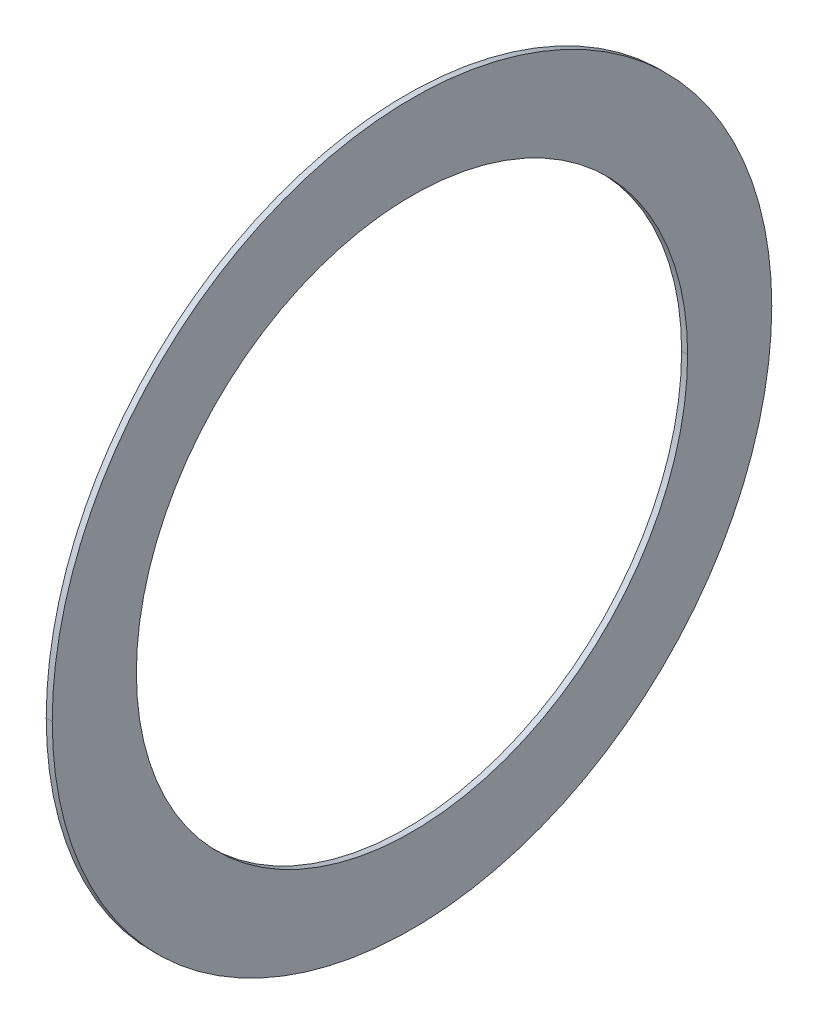
ISO-10303-21;
HEADER;
FILE_DESCRIPTION(('STEP AP214'),'2;1');
FILE_NAME('part.step','',(''),(''),'','','');
FILE_SCHEMA(('AUTOMOTIVE_DESIGN { 1 0 10303 214 1 1 1 1 }'));
ENDSEC;
DATA;
#1=APPLICATION_CONTEXT('core data for automotive mechanical design processes');
#2=APPLICATION_PROTOCOL_DEFINITION('international standard','automotive_design',2000,#1);
#3=PRODUCT_CONTEXT('',#1,'mechanical');
#4=PRODUCT('Part','Part','',(#3));
#5=PRODUCT_RELATED_PRODUCT_CATEGORY('part','',(#4));
#6=PRODUCT_DEFINITION_FORMATION('','',#4);
#7=PRODUCT_DEFINITION_CONTEXT('part definition',#1,'design');
#8=PRODUCT_DEFINITION('design','',#6,#7);
#9=PRODUCT_DEFINITION_SHAPE('','',#8);
#10=(LENGTH_UNIT() NAMED_UNIT(*) SI_UNIT(.MILLI.,.METRE.));
#11=(NAMED_UNIT(*) PLANE_ANGLE_UNIT() SI_UNIT($,.RADIAN.));
#12=(NAMED_UNIT(*) SI_UNIT($,.STERADIAN.) SOLID_ANGLE_UNIT());
#13=UNCERTAINTY_MEASURE_WITH_UNIT(LENGTH_MEASURE(1.E-05),#10,'distance_accuracy_value','');
#14=(GEOMETRIC_REPRESENTATION_CONTEXT(3) GLOBAL_UNCERTAINTY_ASSIGNED_CONTEXT((#13)) GLOBAL_UNIT_ASSIGNED_CONTEXT((#10,
#11,#12)) REPRESENTATION_CONTEXT('',''));
#15=CARTESIAN_POINT('',(0.,0.,0.));
#16=DIRECTION('',(0.,0.,1.));
#17=DIRECTION('',(1.,0.,0.));
#18=AXIS2_PLACEMENT_3D('',#15,#16,#17);
#19=CARTESIAN_POINT('',(0.,31.,0.));
#20=DIRECTION('',(-1.,0.,0.));
#21=DIRECTION('',(0.,0.,1.));
#22=AXIS2_PLACEMENT_3D('',#19,#20,#21);
#23=PLANE('',#22);
#24=CARTESIAN_POINT('',(0.,0.,0.));
#25=DIRECTION('',(1.,0.,0.));
#26=DIRECTION('',(0.,0.,-1.));
#27=AXIS2_PLACEMENT_3D('',#24,#25,#26);
#28=CIRCLE('',#27,23.75);
#29=CARTESIAN_POINT('',(0.,0.,-23.75));
#30=VERTEX_POINT('',#29);
#31=CARTESIAN_POINT('',(0.,0.,23.75));
#32=VERTEX_POINT('',#31);
#33=EDGE_CURVE('E11',#30,#32,#28,.T.);
#34=ORIENTED_EDGE('',*,*,#33,.T.);
#35=CARTESIAN_POINT('',(0.,0.,0.));
#36=DIRECTION('',(1.,0.,0.));
#37=DIRECTION('',(0.,0.,-1.));
#38=AXIS2_PLACEMENT_3D('',#35,#36,#37);
#39=CIRCLE('',#38,23.75);
#40=EDGE_CURVE('E25',#32,#30,#39,.T.);
#41=ORIENTED_EDGE('',*,*,#40,.T.);
#42=EDGE_LOOP('',(#34,#41));
#43=FACE_BOUND('',#42,.T.);
#44=CARTESIAN_POINT('',(0.,0.,0.));
#45=DIRECTION('',(1.,0.,0.));
#46=DIRECTION('',(0.,0.,-1.));
#47=AXIS2_PLACEMENT_3D('',#44,#45,#46);
#48=CIRCLE('',#47,31.);
#49=CARTESIAN_POINT('',(0.,0.,31.));
#50=VERTEX_POINT('',#49);
#51=CARTESIAN_POINT('',(0.,0.,-31.));
#52=VERTEX_POINT('',#51);
#53=EDGE_CURVE('E95',#50,#52,#48,.T.);
#54=ORIENTED_EDGE('',*,*,#53,.F.);
#55=CARTESIAN_POINT('',(0.,0.,0.));
#56=DIRECTION('',(1.,0.,0.));
#57=DIRECTION('',(0.,0.,-1.));
#58=AXIS2_PLACEMENT_3D('',#55,#56,#57);
#59=CIRCLE('',#58,31.);
#60=EDGE_CURVE('E90',#52,#50,#59,.T.);
#61=ORIENTED_EDGE('',*,*,#60,.F.);
#62=EDGE_LOOP('',(#54,#61));
#63=FACE_BOUND('',#62,.T.);
#64=ADVANCED_FACE('F17',(#43,#63),#23,.T.);
#65=CARTESIAN_POINT('',(0.5175,0.,0.));
#66=DIRECTION('',(1.,0.,0.));
#67=DIRECTION('',(0.,-1.,0.));
#68=AXIS2_PLACEMENT_3D('',#65,#66,#67);
#69=CYLINDRICAL_SURFACE('',#68,31.);
#70=DIRECTION('',(1.,0.,0.));
#71=VECTOR('',#70,1.);
#72=CARTESIAN_POINT('',(0.,0.,31.));
#73=LINE('',#72,#71);
#74=CARTESIAN_POINT('',(0.5175,0.,31.));
#75=VERTEX_POINT('',#74);
#76=EDGE_CURVE('E86',#50,#75,#73,.T.);
#77=ORIENTED_EDGE('',*,*,#76,.T.);
#78=CARTESIAN_POINT('',(0.5175,0.,0.));
#79=DIRECTION('',(1.,0.,0.));
#80=DIRECTION('',(0.,0.,-1.));
#81=AXIS2_PLACEMENT_3D('',#78,#79,#80);
#82=CIRCLE('',#81,31.);
#83=CARTESIAN_POINT('',(0.5175,0.,-31.));
#84=VERTEX_POINT('',#83);
#85=EDGE_CURVE('E81',#84,#75,#82,.T.);
#86=ORIENTED_EDGE('',*,*,#85,.F.);
#87=DIRECTION('',(1.,0.,0.));
#88=VECTOR('',#87,1.);
#89=CARTESIAN_POINT('',(0.,0.,-31.));
#90=LINE('',#89,#88);
#91=EDGE_CURVE('E70',#52,#84,#90,.T.);
#92=ORIENTED_EDGE('',*,*,#91,.F.);
#93=ORIENTED_EDGE('',*,*,#60,.T.);
#94=EDGE_LOOP('',(#77,#86,#92,#93));
#95=FACE_BOUND('',#94,.T.);
#96=ADVANCED_FACE('F111',(#95),#69,.T.);
#97=CARTESIAN_POINT('',(0.5175,0.,0.));
#98=DIRECTION('',(1.,0.,0.));
#99=DIRECTION('',(0.,1.,0.));
#100=AXIS2_PLACEMENT_3D('',#97,#98,#99);
#101=CYLINDRICAL_SURFACE('',#100,31.);
#102=ORIENTED_EDGE('',*,*,#76,.F.);
#103=ORIENTED_EDGE('',*,*,#53,.T.);
#104=ORIENTED_EDGE('',*,*,#91,.T.);
#105=CARTESIAN_POINT('',(0.5175,0.,0.));
#106=DIRECTION('',(1.,0.,0.));
#107=DIRECTION('',(0.,0.,-1.));
#108=AXIS2_PLACEMENT_3D('',#105,#106,#107);
#109=CIRCLE('',#108,31.);
#110=EDGE_CURVE('E67',#75,#84,#109,.T.);
#111=ORIENTED_EDGE('',*,*,#110,.F.);
#112=EDGE_LOOP('',(#102,#103,#104,#111));
#113=FACE_BOUND('',#112,.T.);
#114=ADVANCED_FACE('F106',(#113),#101,.T.);
#115=CARTESIAN_POINT('',(0.5175,23.75,0.));
#116=DIRECTION('',(1.,0.,0.));
#117=DIRECTION('',(0.,0.,-1.));
#118=AXIS2_PLACEMENT_3D('',#115,#116,#117);
#119=PLANE('',#118);
#120=ORIENTED_EDGE('',*,*,#85,.T.);
#121=ORIENTED_EDGE('',*,*,#110,.T.);
#122=EDGE_LOOP('',(#120,#121));
#123=FACE_BOUND('',#122,.T.);
#124=CARTESIAN_POINT('',(0.5175,0.,0.));
#125=DIRECTION('',(1.,0.,0.));
#126=DIRECTION('',(0.,0.,-1.));
#127=AXIS2_PLACEMENT_3D('',#124,#125,#126);
#128=CIRCLE('',#127,23.75);
#129=CARTESIAN_POINT('',(0.5175,0.,23.75));
#130=VERTEX_POINT('',#129);
#131=CARTESIAN_POINT('',(0.5175,0.,-23.75));
#132=VERTEX_POINT('',#131);
#133=EDGE_CURVE('E55',#130,#132,#128,.T.);
#134=ORIENTED_EDGE('',*,*,#133,.F.);
#135=CARTESIAN_POINT('',(0.5175,0.,0.));
#136=DIRECTION('',(1.,0.,0.));
#137=DIRECTION('',(0.,0.,-1.));
#138=AXIS2_PLACEMENT_3D('',#135,#136,#137);
#139=CIRCLE('',#138,23.75);
#140=EDGE_CURVE('E51',#132,#130,#139,.T.);
#141=ORIENTED_EDGE('',*,*,#140,.F.);
#142=EDGE_LOOP('',(#134,#141));
#143=FACE_BOUND('',#142,.T.);
#144=ADVANCED_FACE('F53',(#123,#143),#119,.T.);
#145=CARTESIAN_POINT('',(0.5175,0.,0.));
#146=DIRECTION('',(1.,0.,0.));
#147=DIRECTION('',(0.,-1.,0.));
#148=AXIS2_PLACEMENT_3D('',#145,#146,#147);
#149=CYLINDRICAL_SURFACE('',#148,23.75);
#150=DIRECTION('',(1.,0.,0.));
#151=VECTOR('',#150,1.);
#152=CARTESIAN_POINT('',(0.,0.,23.75));
#153=LINE('',#152,#151);
#154=EDGE_CURVE('E59',#32,#130,#153,.T.);
#155=ORIENTED_EDGE('',*,*,#154,.F.);
#156=ORIENTED_EDGE('',*,*,#33,.F.);
#157=DIRECTION('',(1.,0.,0.));
#158=VECTOR('',#157,1.);
#159=CARTESIAN_POINT('',(0.,0.,-23.75));
#160=LINE('',#159,#158);
#161=EDGE_CURVE('E62',#30,#132,#160,.T.);
#162=ORIENTED_EDGE('',*,*,#161,.T.);
#163=ORIENTED_EDGE('',*,*,#140,.T.);
#164=EDGE_LOOP('',(#155,#156,#162,#163));
#165=FACE_BOUND('',#164,.T.);
#166=ADVANCED_FACE('F63',(#165),#149,.F.);
#167=CARTESIAN_POINT('',(0.5175,0.,0.));
#168=DIRECTION('',(1.,0.,0.));
#169=DIRECTION('',(0.,1.,0.));
#170=AXIS2_PLACEMENT_3D('',#167,#168,#169);
#171=CYLINDRICAL_SURFACE('',#170,23.75);
#172=ORIENTED_EDGE('',*,*,#154,.T.);
#173=ORIENTED_EDGE('',*,*,#133,.T.);
#174=ORIENTED_EDGE('',*,*,#161,.F.);
#175=ORIENTED_EDGE('',*,*,#40,.F.);
#176=EDGE_LOOP('',(#172,#173,#174,#175));
#177=FACE_BOUND('',#176,.T.);
#178=ADVANCED_FACE('F66',(#177),#171,.F.);
#179=CLOSED_SHELL('',(#64,#96,#114,#144,#166,#178));
#180=MANIFOLD_SOLID_BREP('B1',#179);
#181=ADVANCED_BREP_SHAPE_REPRESENTATION('',(#18,#180),#14);
#182=SHAPE_DEFINITION_REPRESENTATION(#9,#181);
ENDSEC;
END-ISO-10303-21;
